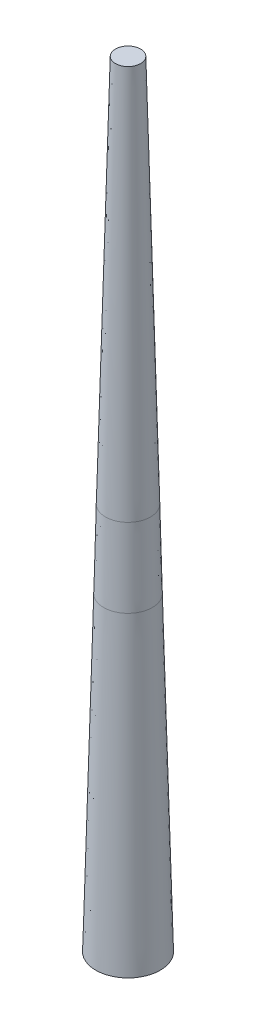
ISO-10303-21;
HEADER;
FILE_DESCRIPTION(('STEP AP214'),'2;1');
FILE_NAME('part.step','',(''),(''),'','','');
FILE_SCHEMA(('AUTOMOTIVE_DESIGN { 1 0 10303 214 1 1 1 1 }'));
ENDSEC;
DATA;
#1=APPLICATION_CONTEXT('core data for automotive mechanical design processes');
#2=APPLICATION_PROTOCOL_DEFINITION('international standard','automotive_design',2000,#1);
#3=PRODUCT_CONTEXT('',#1,'mechanical');
#4=PRODUCT('Part','Part','',(#3));
#5=PRODUCT_RELATED_PRODUCT_CATEGORY('part','',(#4));
#6=PRODUCT_DEFINITION_FORMATION('','',#4);
#7=PRODUCT_DEFINITION_CONTEXT('part definition',#1,'design');
#8=PRODUCT_DEFINITION('design','',#6,#7);
#9=PRODUCT_DEFINITION_SHAPE('','',#8);
#10=(LENGTH_UNIT() NAMED_UNIT(*) SI_UNIT(.MILLI.,.METRE.));
#11=(NAMED_UNIT(*) PLANE_ANGLE_UNIT() SI_UNIT($,.RADIAN.));
#12=(NAMED_UNIT(*) SI_UNIT($,.STERADIAN.) SOLID_ANGLE_UNIT());
#13=UNCERTAINTY_MEASURE_WITH_UNIT(LENGTH_MEASURE(1.E-05),#10,'distance_accuracy_value','');
#14=(GEOMETRIC_REPRESENTATION_CONTEXT(3) GLOBAL_UNCERTAINTY_ASSIGNED_CONTEXT((#13)) GLOBAL_UNIT_ASSIGNED_CONTEXT((#10,
#11,#12)) REPRESENTATION_CONTEXT('',''));
#15=CARTESIAN_POINT('',(0.,0.,0.));
#16=DIRECTION('',(0.,0.,1.));
#17=DIRECTION('',(1.,0.,0.));
#18=AXIS2_PLACEMENT_3D('',#15,#16,#17);
#19=CARTESIAN_POINT('',(0.,0.,0.));
#20=DIRECTION('',(0.,1.,0.));
#21=DIRECTION('',(0.,0.,1.));
#22=AXIS2_PLACEMENT_3D('',#19,#20,#21);
#23=PLANE('',#22);
#24=CARTESIAN_POINT('',(0.,0.,0.));
#25=DIRECTION('',(0.,-1.,0.));
#26=DIRECTION('',(0.,0.,-1.));
#27=AXIS2_PLACEMENT_3D('',#24,#25,#26);
#28=CIRCLE('',#27,3.25);
#29=CARTESIAN_POINT('',(0.,0.,-3.25));
#30=VERTEX_POINT('',#29);
#31=EDGE_CURVE('E10',#30,#30,#28,.T.);
#32=ORIENTED_EDGE('',*,*,#31,.F.);
#33=EDGE_LOOP('',(#32));
#34=FACE_BOUND('',#33,.T.);
#35=ADVANCED_FACE('F31',(#34),#23,.T.);
#36=CARTESIAN_POINT('',(0.,-100.,0.));
#37=DIRECTION('',(0.,-1.,0.));
#38=DIRECTION('',(0.,0.,-1.));
#39=AXIS2_PLACEMENT_3D('',#36,#37,#38);
#40=CONICAL_SURFACE('',#39,5.8,0.0254944750304067);
#41=ORIENTED_EDGE('',*,*,#31,.T.);
#42=EDGE_LOOP('',(#41));
#43=FACE_BOUND('',#42,.T.);
#44=CARTESIAN_POINT('',(0.,-100.,0.));
#45=DIRECTION('',(0.,-1.,0.));
#46=DIRECTION('',(0.,0.,-1.));
#47=AXIS2_PLACEMENT_3D('',#44,#45,#46);
#48=CIRCLE('',#47,5.8);
#49=CARTESIAN_POINT('',(0.,-100.,-5.8));
#50=VERTEX_POINT('',#49);
#51=EDGE_CURVE('E37',#50,#50,#48,.T.);
#52=ORIENTED_EDGE('',*,*,#51,.F.);
#53=EDGE_LOOP('',(#52));
#54=FACE_BOUND('',#53,.T.);
#55=ADVANCED_FACE('F63',(#43,#54),#40,.T.);
#56=CARTESIAN_POINT('',(0.,-120.,0.));
#57=DIRECTION('',(0.,-1.,0.));
#58=DIRECTION('',(0.,0.,-1.));
#59=AXIS2_PLACEMENT_3D('',#56,#57,#58);
#60=CONICAL_SURFACE('',#59,6.26,0.0229959456201158);
#61=ORIENTED_EDGE('',*,*,#51,.T.);
#62=EDGE_LOOP('',(#61));
#63=FACE_BOUND('',#62,.T.);
#64=CARTESIAN_POINT('',(0.,-120.,0.));
#65=DIRECTION('',(0.,-1.,0.));
#66=DIRECTION('',(0.,0.,-1.));
#67=AXIS2_PLACEMENT_3D('',#64,#65,#66);
#68=CIRCLE('',#67,6.26);
#69=CARTESIAN_POINT('',(0.,-120.,-6.26));
#70=VERTEX_POINT('',#69);
#71=EDGE_CURVE('E41',#70,#70,#68,.T.);
#72=ORIENTED_EDGE('',*,*,#71,.F.);
#73=EDGE_LOOP('',(#72));
#74=FACE_BOUND('',#73,.T.);
#75=ADVANCED_FACE('F55',(#63,#74),#60,.T.);
#76=CARTESIAN_POINT('',(0.,-200.,0.));
#77=DIRECTION('',(0.,-1.,0.));
#78=DIRECTION('',(0.,0.,-1.));
#79=AXIS2_PLACEMENT_3D('',#76,#77,#78);
#80=CONICAL_SURFACE('',#79,8.3,0.0254944750304067);
#81=ORIENTED_EDGE('',*,*,#71,.T.);
#82=EDGE_LOOP('',(#81));
#83=FACE_BOUND('',#82,.T.);
#84=CARTESIAN_POINT('',(0.,-200.,0.));
#85=DIRECTION('',(0.,-1.,0.));
#86=DIRECTION('',(0.,0.,-1.));
#87=AXIS2_PLACEMENT_3D('',#84,#85,#86);
#88=CIRCLE('',#87,8.3);
#89=CARTESIAN_POINT('',(0.,-200.,-8.3));
#90=VERTEX_POINT('',#89);
#91=EDGE_CURVE('E45',#90,#90,#88,.T.);
#92=ORIENTED_EDGE('',*,*,#91,.F.);
#93=EDGE_LOOP('',(#92));
#94=FACE_BOUND('',#93,.T.);
#95=ADVANCED_FACE('F53',(#83,#94),#80,.T.);
#96=CARTESIAN_POINT('',(0.,-200.,-8.3));
#97=DIRECTION('',(0.,-1.,0.));
#98=DIRECTION('',(0.,0.,-1.));
#99=AXIS2_PLACEMENT_3D('',#96,#97,#98);
#100=PLANE('',#99);
#101=ORIENTED_EDGE('',*,*,#91,.T.);
#102=EDGE_LOOP('',(#101));
#103=FACE_BOUND('',#102,.T.);
#104=ADVANCED_FACE('F51',(#103),#100,.T.);
#105=CLOSED_SHELL('',(#35,#55,#75,#95,#104));
#106=MANIFOLD_SOLID_BREP('B2',#105);
#107=ADVANCED_BREP_SHAPE_REPRESENTATION('',(#18,#106),#14);
#108=SHAPE_DEFINITION_REPRESENTATION(#9,#107);
ENDSEC;
END-ISO-10303-21;
